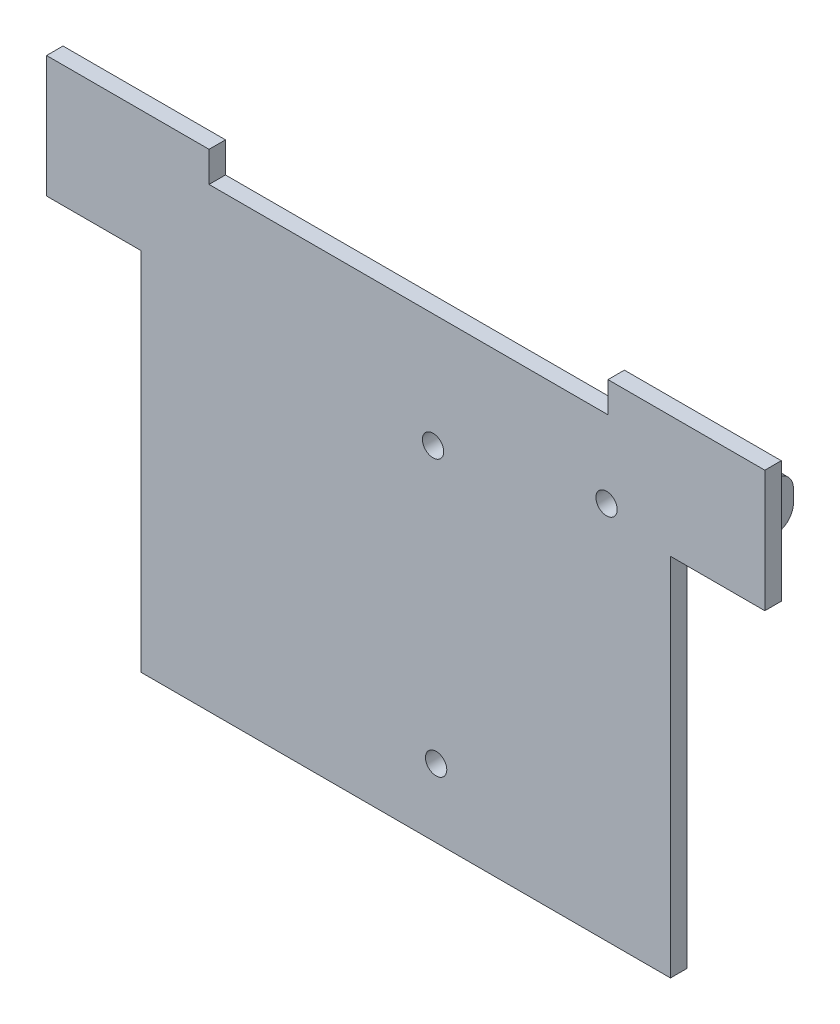
ISO-10303-21;
HEADER;
FILE_DESCRIPTION(('STEP AP214'),'2;1');
FILE_NAME('part.step','',(''),(''),'','','');
FILE_SCHEMA(('AUTOMOTIVE_DESIGN { 1 0 10303 214 1 1 1 1 }'));
ENDSEC;
DATA;
#1=APPLICATION_CONTEXT('core data for automotive mechanical design processes');
#2=APPLICATION_PROTOCOL_DEFINITION('international standard','automotive_design',2000,#1);
#3=PRODUCT_CONTEXT('',#1,'mechanical');
#4=PRODUCT('Part','Part','',(#3));
#5=PRODUCT_RELATED_PRODUCT_CATEGORY('part','',(#4));
#6=PRODUCT_DEFINITION_FORMATION('','',#4);
#7=PRODUCT_DEFINITION_CONTEXT('part definition',#1,'design');
#8=PRODUCT_DEFINITION('design','',#6,#7);
#9=PRODUCT_DEFINITION_SHAPE('','',#8);
#10=(LENGTH_UNIT() NAMED_UNIT(*) SI_UNIT(.MILLI.,.METRE.));
#11=(NAMED_UNIT(*) PLANE_ANGLE_UNIT() SI_UNIT($,.RADIAN.));
#12=(NAMED_UNIT(*) SI_UNIT($,.STERADIAN.) SOLID_ANGLE_UNIT());
#13=UNCERTAINTY_MEASURE_WITH_UNIT(LENGTH_MEASURE(1.E-05),#10,'distance_accuracy_value','');
#14=(GEOMETRIC_REPRESENTATION_CONTEXT(3) GLOBAL_UNCERTAINTY_ASSIGNED_CONTEXT((#13)) GLOBAL_UNIT_ASSIGNED_CONTEXT((#10,
#11,#12)) REPRESENTATION_CONTEXT('',''));
#15=CARTESIAN_POINT('',(0.,0.,0.));
#16=DIRECTION('',(0.,0.,1.));
#17=DIRECTION('',(1.,0.,0.));
#18=AXIS2_PLACEMENT_3D('',#15,#16,#17);
#19=CARTESIAN_POINT('',(-73.7662337662338,56.,2.7));
#20=DIRECTION('',(0.,-1.,0.));
#21=DIRECTION('',(0.,0.,-1.));
#22=AXIS2_PLACEMENT_3D('',#19,#20,#21);
#23=PLANE('',#22);
#24=DIRECTION('',(-1.,0.,0.));
#25=VECTOR('',#24,1.);
#26=CARTESIAN_POINT('',(-73.7662337662338,56.,2.7));
#27=LINE('',#26,#25);
#28=CARTESIAN_POINT('',(-47.0729665984484,56.,2.7));
#29=VERTEX_POINT('',#28);
#30=CARTESIAN_POINT('',(-73.7662337662338,56.,2.7));
#31=VERTEX_POINT('',#30);
#32=EDGE_CURVE('E359',#29,#31,#27,.T.);
#33=ORIENTED_EDGE('',*,*,#32,.F.);
#34=DIRECTION('',(0.,0.,1.));
#35=VECTOR('',#34,1.);
#36=CARTESIAN_POINT('',(-47.0729665984484,56.,-50.3));
#37=LINE('',#36,#35);
#38=CARTESIAN_POINT('',(-47.0729665984484,56.,0.));
#39=VERTEX_POINT('',#38);
#40=EDGE_CURVE('E250',#39,#29,#37,.T.);
#41=ORIENTED_EDGE('',*,*,#40,.F.);
#42=DIRECTION('',(-1.,0.,0.));
#43=VECTOR('',#42,1.);
#44=CARTESIAN_POINT('',(-73.7662337662338,56.,0.));
#45=LINE('',#44,#43);
#46=CARTESIAN_POINT('',(-73.7662337662338,56.,0.));
#47=VERTEX_POINT('',#46);
#48=EDGE_CURVE('E369',#39,#47,#45,.T.);
#49=ORIENTED_EDGE('',*,*,#48,.T.);
#50=DIRECTION('',(0.,0.,-1.));
#51=VECTOR('',#50,1.);
#52=CARTESIAN_POINT('',(-73.7662337662338,56.,2.7));
#53=LINE('',#52,#51);
#54=EDGE_CURVE('E361',#31,#47,#53,.T.);
#55=ORIENTED_EDGE('',*,*,#54,.F.);
#56=EDGE_LOOP('',(#33,#41,#49,#55));
#57=FACE_BOUND('',#56,.T.);
#58=ADVANCED_FACE('F36',(#57),#23,.F.);
#59=CARTESIAN_POINT('',(0.,0.,0.));
#60=DIRECTION('',(0.,0.,1.));
#61=DIRECTION('',(1.,0.,0.));
#62=AXIS2_PLACEMENT_3D('',#59,#60,#61);
#63=PLANE('',#62);
#64=CARTESIAN_POINT('',(-9.76623376633984,-12.7500000000244,0.));
#65=DIRECTION('',(0.,0.,-1.));
#66=DIRECTION('',(-1.,0.,0.));
#67=AXIS2_PLACEMENT_3D('',#64,#65,#66);
#68=CIRCLE('',#67,1.75);
#69=CARTESIAN_POINT('',(-11.5162337663398,-12.7500000000244,0.));
#70=VERTEX_POINT('',#69);
#71=EDGE_CURVE('E456',#70,#70,#68,.T.);
#72=ORIENTED_EDGE('',*,*,#71,.F.);
#73=EDGE_LOOP('',(#72));
#74=FACE_BOUND('',#73,.T.);
#75=CARTESIAN_POINT('',(-10.2662337663398,32.2499999999756,0.));
#76=DIRECTION('',(0.,0.,-1.));
#77=DIRECTION('',(-1.,0.,0.));
#78=AXIS2_PLACEMENT_3D('',#75,#76,#77);
#79=CIRCLE('',#78,1.75);
#80=CARTESIAN_POINT('',(-12.0162337663398,32.2499999999756,0.));
#81=VERTEX_POINT('',#80);
#82=EDGE_CURVE('E467',#81,#81,#79,.T.);
#83=ORIENTED_EDGE('',*,*,#82,.F.);
#84=EDGE_LOOP('',(#83));
#85=FACE_BOUND('',#84,.T.);
#86=CARTESIAN_POINT('',(18.2337662336602,38.2499999999756,0.));
#87=DIRECTION('',(0.,0.,-1.));
#88=DIRECTION('',(-1.,0.,0.));
#89=AXIS2_PLACEMENT_3D('',#86,#87,#88);
#90=CIRCLE('',#89,1.75);
#91=CARTESIAN_POINT('',(16.4837662336602,38.2499999999756,0.));
#92=VERTEX_POINT('',#91);
#93=EDGE_CURVE('E464',#92,#92,#90,.T.);
#94=ORIENTED_EDGE('',*,*,#93,.F.);
#95=EDGE_LOOP('',(#94));
#96=FACE_BOUND('',#95,.T.);
#97=ORIENTED_EDGE('',*,*,#48,.F.);
#98=DIRECTION('',(0.,-1.,0.));
#99=VECTOR('',#98,1.);
#100=CARTESIAN_POINT('',(-47.0729665984484,0.,0.));
#101=LINE('',#100,#99);
#102=CARTESIAN_POINT('',(-47.0729665984484,51.,0.));
#103=VERTEX_POINT('',#102);
#104=EDGE_CURVE('E256',#39,#103,#101,.T.);
#105=ORIENTED_EDGE('',*,*,#104,.T.);
#106=DIRECTION('',(1.,0.,0.));
#107=VECTOR('',#106,1.);
#108=CARTESIAN_POINT('',(0.,51.,0.));
#109=LINE('',#108,#107);
#110=CARTESIAN_POINT('',(18.4609188047904,51.,0.));
#111=VERTEX_POINT('',#110);
#112=EDGE_CURVE('E252',#103,#111,#109,.T.);
#113=ORIENTED_EDGE('',*,*,#112,.T.);
#114=DIRECTION('',(0.,1.,0.));
#115=VECTOR('',#114,1.);
#116=CARTESIAN_POINT('',(18.4609188047904,0.,0.));
#117=LINE('',#116,#115);
#118=CARTESIAN_POINT('',(18.4609188047904,56.,0.));
#119=VERTEX_POINT('',#118);
#120=EDGE_CURVE('E231',#111,#119,#117,.T.);
#121=ORIENTED_EDGE('',*,*,#120,.T.);
#122=CARTESIAN_POINT('',(44.2337662337662,56.,0.));
#123=VERTEX_POINT('',#122);
#124=EDGE_CURVE('E354',#123,#119,#45,.T.);
#125=ORIENTED_EDGE('',*,*,#124,.F.);
#126=DIRECTION('',(0.,1.,0.));
#127=VECTOR('',#126,1.);
#128=CARTESIAN_POINT('',(44.2337662337662,56.,0.));
#129=LINE('',#128,#127);
#130=CARTESIAN_POINT('',(44.2337662337662,36.,0.));
#131=VERTEX_POINT('',#130);
#132=EDGE_CURVE('E367',#131,#123,#129,.T.);
#133=ORIENTED_EDGE('',*,*,#132,.F.);
#134=DIRECTION('',(-1.,0.,0.));
#135=VECTOR('',#134,1.);
#136=CARTESIAN_POINT('',(44.2337662337662,36.,0.));
#137=LINE('',#136,#135);
#138=CARTESIAN_POINT('',(28.7337662337662,36.,0.));
#139=VERTEX_POINT('',#138);
#140=EDGE_CURVE('E347',#131,#139,#137,.T.);
#141=ORIENTED_EDGE('',*,*,#140,.T.);
#142=DIRECTION('',(0.,-1.,0.));
#143=VECTOR('',#142,1.);
#144=CARTESIAN_POINT('',(28.7337662337662,36.,0.));
#145=LINE('',#144,#143);
#146=CARTESIAN_POINT('',(28.7337662337662,-24.,0.));
#147=VERTEX_POINT('',#146);
#148=EDGE_CURVE('E330',#139,#147,#145,.T.);
#149=ORIENTED_EDGE('',*,*,#148,.T.);
#150=DIRECTION('',(1.,0.,0.));
#151=VECTOR('',#150,1.);
#152=CARTESIAN_POINT('',(-73.7662337662338,-24.,0.));
#153=LINE('',#152,#151);
#154=CARTESIAN_POINT('',(-58.2662337662337,-24.,0.));
#155=VERTEX_POINT('',#154);
#156=EDGE_CURVE('E364',#155,#147,#153,.T.);
#157=ORIENTED_EDGE('',*,*,#156,.F.);
#158=DIRECTION('',(0.,1.,0.));
#159=VECTOR('',#158,1.);
#160=CARTESIAN_POINT('',(-58.2662337662338,36.,0.));
#161=LINE('',#160,#159);
#162=CARTESIAN_POINT('',(-58.2662337662338,36.,0.));
#163=VERTEX_POINT('',#162);
#164=EDGE_CURVE('E314',#155,#163,#161,.T.);
#165=ORIENTED_EDGE('',*,*,#164,.T.);
#166=DIRECTION('',(-1.,0.,0.));
#167=VECTOR('',#166,1.);
#168=CARTESIAN_POINT('',(-73.7662337662338,36.,0.));
#169=LINE('',#168,#167);
#170=CARTESIAN_POINT('',(-73.7662337662338,36.,0.));
#171=VERTEX_POINT('',#170);
#172=EDGE_CURVE('E336',#163,#171,#169,.T.);
#173=ORIENTED_EDGE('',*,*,#172,.T.);
#174=DIRECTION('',(0.,-1.,0.));
#175=VECTOR('',#174,1.);
#176=CARTESIAN_POINT('',(-73.7662337662338,56.,0.));
#177=LINE('',#176,#175);
#178=EDGE_CURVE('E345',#47,#171,#177,.T.);
#179=ORIENTED_EDGE('',*,*,#178,.F.);
#180=EDGE_LOOP('',(#97,#105,#113,#121,#125,#133,#141,#149,#157,#165,#173,#179));
#181=FACE_BOUND('',#180,.T.);
#182=DIRECTION('',(0.,-1.,0.));
#183=VECTOR('',#182,1.);
#184=CARTESIAN_POINT('',(-63.7662337662338,40.,0.));
#185=LINE('',#184,#183);
#186=CARTESIAN_POINT('',(-63.7662337662338,51.,0.));
#187=VERTEX_POINT('',#186);
#188=CARTESIAN_POINT('',(-63.7662337662338,37.,0.));
#189=VERTEX_POINT('',#188);
#190=EDGE_CURVE('E296',#187,#189,#185,.T.);
#191=ORIENTED_EDGE('',*,*,#190,.F.);
#192=DIRECTION('',(1.,0.,0.));
#193=VECTOR('',#192,1.);
#194=CARTESIAN_POINT('',(-67.7662337662338,51.,0.));
#195=LINE('',#194,#193);
#196=CARTESIAN_POINT('',(-67.7662337662338,51.,0.));
#197=VERTEX_POINT('',#196);
#198=EDGE_CURVE('E387',#187,#197,#195,.F.);
#199=ORIENTED_EDGE('',*,*,#198,.T.);
#200=DIRECTION('',(0.,1.,0.));
#201=VECTOR('',#200,1.);
#202=CARTESIAN_POINT('',(-67.7662337662338,40.,0.));
#203=LINE('',#202,#201);
#204=CARTESIAN_POINT('',(-67.7662337662338,37.,0.));
#205=VERTEX_POINT('',#204);
#206=EDGE_CURVE('E287',#205,#197,#203,.T.);
#207=ORIENTED_EDGE('',*,*,#206,.F.);
#208=DIRECTION('',(-1.,0.,0.));
#209=VECTOR('',#208,1.);
#210=CARTESIAN_POINT('',(-63.7662337662338,37.,0.));
#211=LINE('',#210,#209);
#212=EDGE_CURVE('E384',#205,#189,#211,.F.);
#213=ORIENTED_EDGE('',*,*,#212,.T.);
#214=EDGE_LOOP('',(#191,#199,#207,#213));
#215=FACE_BOUND('',#214,.T.);
#216=DIRECTION('',(0.,-1.,0.));
#217=VECTOR('',#216,1.);
#218=CARTESIAN_POINT('',(38.2337662337662,40.,0.));
#219=LINE('',#218,#217);
#220=CARTESIAN_POINT('',(38.2337662337662,51.,0.));
#221=VERTEX_POINT('',#220);
#222=CARTESIAN_POINT('',(38.2337662337662,37.,0.));
#223=VERTEX_POINT('',#222);
#224=EDGE_CURVE('E284',#221,#223,#219,.T.);
#225=ORIENTED_EDGE('',*,*,#224,.F.);
#226=DIRECTION('',(1.,0.,0.));
#227=VECTOR('',#226,1.);
#228=CARTESIAN_POINT('',(34.2337662337662,51.,0.));
#229=LINE('',#228,#227);
#230=CARTESIAN_POINT('',(34.2337662337662,51.,0.));
#231=VERTEX_POINT('',#230);
#232=EDGE_CURVE('E393',#221,#231,#229,.F.);
#233=ORIENTED_EDGE('',*,*,#232,.T.);
#234=DIRECTION('',(0.,1.,0.));
#235=VECTOR('',#234,1.);
#236=CARTESIAN_POINT('',(34.2337662337662,40.,0.));
#237=LINE('',#236,#235);
#238=CARTESIAN_POINT('',(34.2337662337662,37.,0.));
#239=VERTEX_POINT('',#238);
#240=EDGE_CURVE('E282',#239,#231,#237,.T.);
#241=ORIENTED_EDGE('',*,*,#240,.F.);
#242=DIRECTION('',(-1.,0.,0.));
#243=VECTOR('',#242,1.);
#244=CARTESIAN_POINT('',(38.2337662337662,37.,0.));
#245=LINE('',#244,#243);
#246=EDGE_CURVE('E390',#239,#223,#245,.F.);
#247=ORIENTED_EDGE('',*,*,#246,.T.);
#248=EDGE_LOOP('',(#225,#233,#241,#247));
#249=FACE_BOUND('',#248,.T.);
#250=ADVANCED_FACE('F475',(#74,#85,#96,#181,#215,#249),#63,.F.);
#251=CARTESIAN_POINT('',(-73.7662337662338,56.,2.7));
#252=DIRECTION('',(1.,0.,0.));
#253=DIRECTION('',(0.,1.,0.));
#254=AXIS2_PLACEMENT_3D('',#251,#252,#253);
#255=PLANE('',#254);
#256=ORIENTED_EDGE('',*,*,#178,.T.);
#257=DIRECTION('',(0.,0.,1.));
#258=VECTOR('',#257,1.);
#259=CARTESIAN_POINT('',(-73.7662337662338,36.,0.));
#260=LINE('',#259,#258);
#261=CARTESIAN_POINT('',(-73.7662337662338,36.,2.7));
#262=VERTEX_POINT('',#261);
#263=EDGE_CURVE('E339',#171,#262,#260,.T.);
#264=ORIENTED_EDGE('',*,*,#263,.T.);
#265=DIRECTION('',(0.,-1.,0.));
#266=VECTOR('',#265,1.);
#267=CARTESIAN_POINT('',(-73.7662337662338,56.,2.7));
#268=LINE('',#267,#266);
#269=EDGE_CURVE('E350',#31,#262,#268,.T.);
#270=ORIENTED_EDGE('',*,*,#269,.F.);
#271=ORIENTED_EDGE('',*,*,#54,.T.);
#272=EDGE_LOOP('',(#256,#264,#270,#271));
#273=FACE_BOUND('',#272,.T.);
#274=ADVANCED_FACE('F478',(#273),#255,.F.);
#275=CARTESIAN_POINT('',(-73.7662337662338,-24.,2.7));
#276=DIRECTION('',(0.,1.,0.));
#277=DIRECTION('',(0.,0.,1.));
#278=AXIS2_PLACEMENT_3D('',#275,#276,#277);
#279=PLANE('',#278);
#280=DIRECTION('',(1.,0.,0.));
#281=VECTOR('',#280,1.);
#282=CARTESIAN_POINT('',(-73.7662337662338,-24.,2.7));
#283=LINE('',#282,#281);
#284=CARTESIAN_POINT('',(-58.2662337662337,-24.,2.7));
#285=VERTEX_POINT('',#284);
#286=CARTESIAN_POINT('',(28.7337662337662,-24.,2.7));
#287=VERTEX_POINT('',#286);
#288=EDGE_CURVE('E353',#285,#287,#283,.T.);
#289=ORIENTED_EDGE('',*,*,#288,.F.);
#290=DIRECTION('',(0.,0.,1.));
#291=VECTOR('',#290,1.);
#292=CARTESIAN_POINT('',(-58.2662337662337,-24.,0.));
#293=LINE('',#292,#291);
#294=EDGE_CURVE('E317',#155,#285,#293,.T.);
#295=ORIENTED_EDGE('',*,*,#294,.F.);
#296=ORIENTED_EDGE('',*,*,#156,.T.);
#297=DIRECTION('',(0.,0.,1.));
#298=VECTOR('',#297,1.);
#299=CARTESIAN_POINT('',(28.7337662337662,-24.,0.));
#300=LINE('',#299,#298);
#301=EDGE_CURVE('E313',#147,#287,#300,.T.);
#302=ORIENTED_EDGE('',*,*,#301,.T.);
#303=EDGE_LOOP('',(#289,#295,#296,#302));
#304=FACE_BOUND('',#303,.T.);
#305=ADVANCED_FACE('F553',(#304),#279,.F.);
#306=CARTESIAN_POINT('',(44.2337662337662,56.,2.7));
#307=DIRECTION('',(-1.,0.,0.));
#308=DIRECTION('',(0.,-1.,0.));
#309=AXIS2_PLACEMENT_3D('',#306,#307,#308);
#310=PLANE('',#309);
#311=DIRECTION('',(0.,1.,0.));
#312=VECTOR('',#311,1.);
#313=CARTESIAN_POINT('',(44.2337662337662,56.,2.7));
#314=LINE('',#313,#312);
#315=CARTESIAN_POINT('',(44.2337662337662,36.,2.7));
#316=VERTEX_POINT('',#315);
#317=CARTESIAN_POINT('',(44.2337662337662,56.,2.7));
#318=VERTEX_POINT('',#317);
#319=EDGE_CURVE('E357',#316,#318,#314,.T.);
#320=ORIENTED_EDGE('',*,*,#319,.F.);
#321=DIRECTION('',(0.,0.,1.));
#322=VECTOR('',#321,1.);
#323=CARTESIAN_POINT('',(44.2337662337662,36.,0.));
#324=LINE('',#323,#322);
#325=EDGE_CURVE('E325',#131,#316,#324,.T.);
#326=ORIENTED_EDGE('',*,*,#325,.F.);
#327=ORIENTED_EDGE('',*,*,#132,.T.);
#328=DIRECTION('',(0.,0.,-1.));
#329=VECTOR('',#328,1.);
#330=CARTESIAN_POINT('',(44.2337662337662,56.,2.7));
#331=LINE('',#330,#329);
#332=EDGE_CURVE('E374',#318,#123,#331,.T.);
#333=ORIENTED_EDGE('',*,*,#332,.F.);
#334=EDGE_LOOP('',(#320,#326,#327,#333));
#335=FACE_BOUND('',#334,.T.);
#336=ADVANCED_FACE('F544',(#335),#310,.F.);
#337=ORIENTED_EDGE('',*,*,#124,.T.);
#338=DIRECTION('',(0.,0.,1.));
#339=VECTOR('',#338,1.);
#340=CARTESIAN_POINT('',(18.4609188047904,56.,-50.3));
#341=LINE('',#340,#339);
#342=CARTESIAN_POINT('',(18.4609188047904,56.,2.7));
#343=VERTEX_POINT('',#342);
#344=EDGE_CURVE('E234',#119,#343,#341,.T.);
#345=ORIENTED_EDGE('',*,*,#344,.T.);
#346=EDGE_CURVE('E245',#318,#343,#27,.T.);
#347=ORIENTED_EDGE('',*,*,#346,.F.);
#348=ORIENTED_EDGE('',*,*,#332,.T.);
#349=EDGE_LOOP('',(#337,#345,#347,#348));
#350=FACE_BOUND('',#349,.T.);
#351=ADVANCED_FACE('F538',(#350),#23,.F.);
#352=CARTESIAN_POINT('',(0.,0.,2.7));
#353=DIRECTION('',(0.,0.,1.));
#354=DIRECTION('',(1.,0.,0.));
#355=AXIS2_PLACEMENT_3D('',#352,#353,#354);
#356=PLANE('',#355);
#357=CARTESIAN_POINT('',(-9.76623376633984,-12.7500000000244,2.7));
#358=DIRECTION('',(0.,0.,1.));
#359=DIRECTION('',(1.,0.,0.));
#360=AXIS2_PLACEMENT_3D('',#357,#358,#359);
#361=CIRCLE('',#360,1.75);
#362=CARTESIAN_POINT('',(-8.01623376633984,-12.7500000000244,2.7));
#363=VERTEX_POINT('',#362);
#364=EDGE_CURVE('E40',#363,#363,#361,.T.);
#365=ORIENTED_EDGE('',*,*,#364,.F.);
#366=EDGE_LOOP('',(#365));
#367=FACE_BOUND('',#366,.T.);
#368=CARTESIAN_POINT('',(-10.2662337663398,32.2499999999756,2.7));
#369=DIRECTION('',(0.,0.,1.));
#370=DIRECTION('',(1.,0.,0.));
#371=AXIS2_PLACEMENT_3D('',#368,#369,#370);
#372=CIRCLE('',#371,1.75);
#373=CARTESIAN_POINT('',(-8.51623376633984,32.2499999999756,2.7));
#374=VERTEX_POINT('',#373);
#375=EDGE_CURVE('E455',#374,#374,#372,.T.);
#376=ORIENTED_EDGE('',*,*,#375,.F.);
#377=EDGE_LOOP('',(#376));
#378=FACE_BOUND('',#377,.T.);
#379=CARTESIAN_POINT('',(18.2337662336602,38.2499999999756,2.7));
#380=DIRECTION('',(0.,0.,1.));
#381=DIRECTION('',(1.,0.,0.));
#382=AXIS2_PLACEMENT_3D('',#379,#380,#381);
#383=CIRCLE('',#382,1.75);
#384=CARTESIAN_POINT('',(19.9837662336602,38.2499999999756,2.7));
#385=VERTEX_POINT('',#384);
#386=EDGE_CURVE('E453',#385,#385,#383,.T.);
#387=ORIENTED_EDGE('',*,*,#386,.F.);
#388=EDGE_LOOP('',(#387));
#389=FACE_BOUND('',#388,.T.);
#390=DIRECTION('',(0.,-1.,0.));
#391=VECTOR('',#390,1.);
#392=CARTESIAN_POINT('',(-47.0729665984484,56.,2.7));
#393=LINE('',#392,#391);
#394=CARTESIAN_POINT('',(-47.0729665984484,51.,2.7));
#395=VERTEX_POINT('',#394);
#396=EDGE_CURVE('E53',#29,#395,#393,.T.);
#397=ORIENTED_EDGE('',*,*,#396,.F.);
#398=ORIENTED_EDGE('',*,*,#32,.T.);
#399=ORIENTED_EDGE('',*,*,#269,.T.);
#400=DIRECTION('',(-1.,0.,0.));
#401=VECTOR('',#400,1.);
#402=CARTESIAN_POINT('',(-73.7662337662338,36.,2.7));
#403=LINE('',#402,#401);
#404=CARTESIAN_POINT('',(-58.2662337662338,36.,2.7));
#405=VERTEX_POINT('',#404);
#406=EDGE_CURVE('E340',#405,#262,#403,.T.);
#407=ORIENTED_EDGE('',*,*,#406,.F.);
#408=DIRECTION('',(0.,1.,0.));
#409=VECTOR('',#408,1.);
#410=CARTESIAN_POINT('',(-58.2662337662338,36.,2.7));
#411=LINE('',#410,#409);
#412=EDGE_CURVE('E318',#285,#405,#411,.T.);
#413=ORIENTED_EDGE('',*,*,#412,.F.);
#414=ORIENTED_EDGE('',*,*,#288,.T.);
#415=DIRECTION('',(0.,-1.,0.));
#416=VECTOR('',#415,1.);
#417=CARTESIAN_POINT('',(28.7337662337662,36.,2.7));
#418=LINE('',#417,#416);
#419=CARTESIAN_POINT('',(28.7337662337662,36.,2.7));
#420=VERTEX_POINT('',#419);
#421=EDGE_CURVE('E321',#420,#287,#418,.T.);
#422=ORIENTED_EDGE('',*,*,#421,.F.);
#423=DIRECTION('',(-1.,0.,0.));
#424=VECTOR('',#423,1.);
#425=CARTESIAN_POINT('',(44.2337662337662,36.,2.7));
#426=LINE('',#425,#424);
#427=EDGE_CURVE('E342',#316,#420,#426,.T.);
#428=ORIENTED_EDGE('',*,*,#427,.F.);
#429=ORIENTED_EDGE('',*,*,#319,.T.);
#430=ORIENTED_EDGE('',*,*,#346,.T.);
#431=DIRECTION('',(0.,1.,0.));
#432=VECTOR('',#431,1.);
#433=CARTESIAN_POINT('',(18.4609188047904,56.,2.7));
#434=LINE('',#433,#432);
#435=CARTESIAN_POINT('',(18.4609188047904,51.,2.7));
#436=VERTEX_POINT('',#435);
#437=EDGE_CURVE('E228',#436,#343,#434,.T.);
#438=ORIENTED_EDGE('',*,*,#437,.F.);
#439=DIRECTION('',(1.,0.,0.));
#440=VECTOR('',#439,1.);
#441=CARTESIAN_POINT('',(-47.0729665984484,51.,2.7));
#442=LINE('',#441,#440);
#443=EDGE_CURVE('E238',#395,#436,#442,.T.);
#444=ORIENTED_EDGE('',*,*,#443,.F.);
#445=EDGE_LOOP('',(#397,#398,#399,#407,#413,#414,#422,#428,#429,#430,#438,#444));
#446=FACE_BOUND('',#445,.T.);
#447=ADVANCED_FACE('F243',(#367,#378,#389,#446),#356,.T.);
#448=CARTESIAN_POINT('',(44.2337662337662,36.,0.));
#449=DIRECTION('',(0.,1.,0.));
#450=DIRECTION('',(0.,0.,1.));
#451=AXIS2_PLACEMENT_3D('',#448,#449,#450);
#452=PLANE('',#451);
#453=ORIENTED_EDGE('',*,*,#427,.T.);
#454=DIRECTION('',(0.,0.,1.));
#455=VECTOR('',#454,1.);
#456=CARTESIAN_POINT('',(28.7337662337662,36.,0.));
#457=LINE('',#456,#455);
#458=EDGE_CURVE('E327',#139,#420,#457,.T.);
#459=ORIENTED_EDGE('',*,*,#458,.F.);
#460=ORIENTED_EDGE('',*,*,#140,.F.);
#461=ORIENTED_EDGE('',*,*,#325,.T.);
#462=EDGE_LOOP('',(#453,#459,#460,#461));
#463=FACE_BOUND('',#462,.T.);
#464=ADVANCED_FACE('F550',(#463),#452,.F.);
#465=CARTESIAN_POINT('',(-73.7662337662338,36.,0.));
#466=DIRECTION('',(0.,1.,0.));
#467=DIRECTION('',(0.,0.,1.));
#468=AXIS2_PLACEMENT_3D('',#465,#466,#467);
#469=PLANE('',#468);
#470=ORIENTED_EDGE('',*,*,#406,.T.);
#471=ORIENTED_EDGE('',*,*,#263,.F.);
#472=ORIENTED_EDGE('',*,*,#172,.F.);
#473=DIRECTION('',(0.,0.,1.));
#474=VECTOR('',#473,1.);
#475=CARTESIAN_POINT('',(-58.2662337662338,36.,0.));
#476=LINE('',#475,#474);
#477=EDGE_CURVE('E322',#163,#405,#476,.T.);
#478=ORIENTED_EDGE('',*,*,#477,.T.);
#479=EDGE_LOOP('',(#470,#471,#472,#478));
#480=FACE_BOUND('',#479,.T.);
#481=ADVANCED_FACE('F565',(#480),#469,.F.);
#482=CARTESIAN_POINT('',(-58.2662337662338,36.,0.));
#483=DIRECTION('',(1.,0.,0.));
#484=DIRECTION('',(0.,1.,0.));
#485=AXIS2_PLACEMENT_3D('',#482,#483,#484);
#486=PLANE('',#485);
#487=ORIENTED_EDGE('',*,*,#412,.T.);
#488=ORIENTED_EDGE('',*,*,#477,.F.);
#489=ORIENTED_EDGE('',*,*,#164,.F.);
#490=ORIENTED_EDGE('',*,*,#294,.T.);
#491=EDGE_LOOP('',(#487,#488,#489,#490));
#492=FACE_BOUND('',#491,.T.);
#493=ADVANCED_FACE('F570',(#492),#486,.F.);
#494=CARTESIAN_POINT('',(28.7337662337662,36.,0.));
#495=DIRECTION('',(-1.,0.,0.));
#496=DIRECTION('',(0.,0.,1.));
#497=AXIS2_PLACEMENT_3D('',#494,#495,#496);
#498=PLANE('',#497);
#499=ORIENTED_EDGE('',*,*,#421,.T.);
#500=ORIENTED_EDGE('',*,*,#301,.F.);
#501=ORIENTED_EDGE('',*,*,#148,.F.);
#502=ORIENTED_EDGE('',*,*,#458,.T.);
#503=EDGE_LOOP('',(#499,#500,#501,#502));
#504=FACE_BOUND('',#503,.T.);
#505=ADVANCED_FACE('F577',(#504),#498,.F.);
#506=CARTESIAN_POINT('',(-67.7662337662338,40.,-8.));
#507=DIRECTION('',(1.,0.,0.));
#508=DIRECTION('',(0.,0.,-1.));
#509=AXIS2_PLACEMENT_3D('',#506,#507,#508);
#510=PLANE('',#509);
#511=CARTESIAN_POINT('',(-67.7662337662338,44.,-4.));
#512=DIRECTION('',(1.,0.,0.));
#513=DIRECTION('',(0.,0.,-1.));
#514=AXIS2_PLACEMENT_3D('',#511,#512,#513);
#515=CIRCLE('',#514,1.75);
#516=CARTESIAN_POINT('',(-67.7662337662338,44.,-5.75));
#517=VERTEX_POINT('',#516);
#518=EDGE_CURVE('E266',#517,#517,#515,.T.);
#519=ORIENTED_EDGE('',*,*,#518,.T.);
#520=EDGE_LOOP('',(#519));
#521=FACE_BOUND('',#520,.T.);
#522=DIRECTION('',(0.,1.,0.));
#523=VECTOR('',#522,1.);
#524=CARTESIAN_POINT('',(-67.7662337662338,40.,-8.));
#525=LINE('',#524,#523);
#526=CARTESIAN_POINT('',(-67.7662337662338,43.,-8.));
#527=VERTEX_POINT('',#526);
#528=CARTESIAN_POINT('',(-67.7662337662338,45.,-8.));
#529=VERTEX_POINT('',#528);
#530=EDGE_CURVE('E292',#527,#529,#525,.T.);
#531=ORIENTED_EDGE('',*,*,#530,.F.);
#532=CARTESIAN_POINT('',(-67.7662337662338,43.,-5.));
#533=DIRECTION('',(1.,0.,0.));
#534=DIRECTION('',(0.,0.,-1.));
#535=AXIS2_PLACEMENT_3D('',#532,#533,#534);
#536=CIRCLE('',#535,3.);
#537=CARTESIAN_POINT('',(-67.7662337662338,40.,-5.));
#538=VERTEX_POINT('',#537);
#539=EDGE_CURVE('E423',#527,#538,#536,.F.);
#540=ORIENTED_EDGE('',*,*,#539,.T.);
#541=DIRECTION('',(0.,0.,1.));
#542=VECTOR('',#541,1.);
#543=CARTESIAN_POINT('',(-67.7662337662338,40.,-8.));
#544=LINE('',#543,#542);
#545=CARTESIAN_POINT('',(-67.7662337662338,40.,-3.));
#546=VERTEX_POINT('',#545);
#547=EDGE_CURVE('E299',#538,#546,#544,.T.);
#548=ORIENTED_EDGE('',*,*,#547,.T.);
#549=CARTESIAN_POINT('',(-67.7662337662338,37.,-3.));
#550=DIRECTION('',(1.,0.,0.));
#551=DIRECTION('',(0.,0.,-1.));
#552=AXIS2_PLACEMENT_3D('',#549,#550,#551);
#553=CIRCLE('',#552,3.);
#554=EDGE_CURVE('E45',#546,#205,#553,.T.);
#555=ORIENTED_EDGE('',*,*,#554,.T.);
#556=ORIENTED_EDGE('',*,*,#206,.T.);
#557=CARTESIAN_POINT('',(-67.7662337662338,51.,-3.));
#558=DIRECTION('',(1.,0.,0.));
#559=DIRECTION('',(0.,0.,-1.));
#560=AXIS2_PLACEMENT_3D('',#557,#558,#559);
#561=CIRCLE('',#560,3.);
#562=CARTESIAN_POINT('',(-67.7662337662338,48.,-3.));
#563=VERTEX_POINT('',#562);
#564=EDGE_CURVE('E449',#197,#563,#561,.T.);
#565=ORIENTED_EDGE('',*,*,#564,.T.);
#566=DIRECTION('',(0.,0.,1.));
#567=VECTOR('',#566,1.);
#568=CARTESIAN_POINT('',(-67.7662337662338,48.,-8.));
#569=LINE('',#568,#567);
#570=CARTESIAN_POINT('',(-67.7662337662338,48.,-5.));
#571=VERTEX_POINT('',#570);
#572=EDGE_CURVE('E310',#571,#563,#569,.T.);
#573=ORIENTED_EDGE('',*,*,#572,.F.);
#574=CARTESIAN_POINT('',(-67.7662337662338,45.,-5.));
#575=DIRECTION('',(1.,0.,0.));
#576=DIRECTION('',(0.,0.,-1.));
#577=AXIS2_PLACEMENT_3D('',#574,#575,#576);
#578=CIRCLE('',#577,3.);
#579=EDGE_CURVE('E421',#571,#529,#578,.F.);
#580=ORIENTED_EDGE('',*,*,#579,.T.);
#581=EDGE_LOOP('',(#531,#540,#548,#555,#556,#565,#573,#580));
#582=FACE_BOUND('',#581,.T.);
#583=ADVANCED_FACE('F591',(#521,#582),#510,.F.);
#584=CARTESIAN_POINT('',(-67.7662337662338,48.,-8.));
#585=DIRECTION('',(0.,-1.,0.));
#586=DIRECTION('',(1.,0.,0.));
#587=AXIS2_PLACEMENT_3D('',#584,#585,#586);
#588=PLANE('',#587);
#589=DIRECTION('',(0.,0.,1.));
#590=VECTOR('',#589,1.);
#591=CARTESIAN_POINT('',(-63.7662337662338,48.,-8.));
#592=LINE('',#591,#590);
#593=CARTESIAN_POINT('',(-63.7662337662338,48.,-5.));
#594=VERTEX_POINT('',#593);
#595=CARTESIAN_POINT('',(-63.7662337662338,48.,-3.));
#596=VERTEX_POINT('',#595);
#597=EDGE_CURVE('E307',#594,#596,#592,.T.);
#598=ORIENTED_EDGE('',*,*,#597,.F.);
#599=DIRECTION('',(1.,0.,0.));
#600=VECTOR('',#599,1.);
#601=CARTESIAN_POINT('',(-67.7662337662338,48.,-5.));
#602=LINE('',#601,#600);
#603=EDGE_CURVE('E436',#594,#571,#602,.F.);
#604=ORIENTED_EDGE('',*,*,#603,.T.);
#605=ORIENTED_EDGE('',*,*,#572,.T.);
#606=DIRECTION('',(1.,0.,0.));
#607=VECTOR('',#606,1.);
#608=CARTESIAN_POINT('',(-63.7662337662338,48.,-3.));
#609=LINE('',#608,#607);
#610=EDGE_CURVE('E434',#563,#596,#609,.T.);
#611=ORIENTED_EDGE('',*,*,#610,.T.);
#612=EDGE_LOOP('',(#598,#604,#605,#611));
#613=FACE_BOUND('',#612,.T.);
#614=ADVANCED_FACE('F596',(#613),#588,.F.);
#615=CARTESIAN_POINT('',(-63.7662337662338,40.,-8.));
#616=DIRECTION('',(-1.,0.,0.));
#617=DIRECTION('',(0.,0.,1.));
#618=AXIS2_PLACEMENT_3D('',#615,#616,#617);
#619=PLANE('',#618);
#620=CARTESIAN_POINT('',(-63.7662337662338,44.,-4.));
#621=DIRECTION('',(-1.,0.,0.));
#622=DIRECTION('',(0.,0.,1.));
#623=AXIS2_PLACEMENT_3D('',#620,#621,#622);
#624=CIRCLE('',#623,1.75);
#625=CARTESIAN_POINT('',(-63.7662337662338,44.,-2.25));
#626=VERTEX_POINT('',#625);
#627=EDGE_CURVE('E263',#626,#626,#624,.T.);
#628=ORIENTED_EDGE('',*,*,#627,.T.);
#629=EDGE_LOOP('',(#628));
#630=FACE_BOUND('',#629,.T.);
#631=DIRECTION('',(0.,0.,1.));
#632=VECTOR('',#631,1.);
#633=CARTESIAN_POINT('',(-63.7662337662338,40.,-8.));
#634=LINE('',#633,#632);
#635=CARTESIAN_POINT('',(-63.7662337662338,40.,-5.));
#636=VERTEX_POINT('',#635);
#637=CARTESIAN_POINT('',(-63.7662337662338,40.,-3.));
#638=VERTEX_POINT('',#637);
#639=EDGE_CURVE('E304',#636,#638,#634,.T.);
#640=ORIENTED_EDGE('',*,*,#639,.F.);
#641=CARTESIAN_POINT('',(-63.7662337662338,43.,-5.));
#642=DIRECTION('',(-1.,0.,0.));
#643=DIRECTION('',(0.,0.,1.));
#644=AXIS2_PLACEMENT_3D('',#641,#642,#643);
#645=CIRCLE('',#644,3.);
#646=CARTESIAN_POINT('',(-63.7662337662338,43.,-8.));
#647=VERTEX_POINT('',#646);
#648=EDGE_CURVE('E432',#636,#647,#645,.F.);
#649=ORIENTED_EDGE('',*,*,#648,.T.);
#650=DIRECTION('',(0.,-1.,0.));
#651=VECTOR('',#650,1.);
#652=CARTESIAN_POINT('',(-63.7662337662338,40.,-8.));
#653=LINE('',#652,#651);
#654=CARTESIAN_POINT('',(-63.7662337662338,45.,-8.));
#655=VERTEX_POINT('',#654);
#656=EDGE_CURVE('E295',#655,#647,#653,.T.);
#657=ORIENTED_EDGE('',*,*,#656,.F.);
#658=CARTESIAN_POINT('',(-63.7662337662338,45.,-5.));
#659=DIRECTION('',(-1.,0.,0.));
#660=DIRECTION('',(0.,0.,1.));
#661=AXIS2_PLACEMENT_3D('',#658,#659,#660);
#662=CIRCLE('',#661,3.);
#663=EDGE_CURVE('E430',#655,#594,#662,.F.);
#664=ORIENTED_EDGE('',*,*,#663,.T.);
#665=ORIENTED_EDGE('',*,*,#597,.T.);
#666=CARTESIAN_POINT('',(-63.7662337662338,51.,-3.));
#667=DIRECTION('',(-1.,0.,0.));
#668=DIRECTION('',(0.,0.,1.));
#669=AXIS2_PLACEMENT_3D('',#666,#667,#668);
#670=CIRCLE('',#669,3.);
#671=EDGE_CURVE('E61',#596,#187,#670,.T.);
#672=ORIENTED_EDGE('',*,*,#671,.T.);
#673=ORIENTED_EDGE('',*,*,#190,.T.);
#674=CARTESIAN_POINT('',(-63.7662337662338,37.,-3.));
#675=DIRECTION('',(-1.,0.,0.));
#676=DIRECTION('',(0.,0.,1.));
#677=AXIS2_PLACEMENT_3D('',#674,#675,#676);
#678=CIRCLE('',#677,3.);
#679=EDGE_CURVE('E11',#189,#638,#678,.T.);
#680=ORIENTED_EDGE('',*,*,#679,.T.);
#681=EDGE_LOOP('',(#640,#649,#657,#664,#665,#672,#673,#680));
#682=FACE_BOUND('',#681,.T.);
#683=ADVANCED_FACE('F600',(#630,#682),#619,.F.);
#684=CARTESIAN_POINT('',(-67.7662337662338,40.,-8.));
#685=DIRECTION('',(0.,1.,0.));
#686=DIRECTION('',(0.,0.,1.));
#687=AXIS2_PLACEMENT_3D('',#684,#685,#686);
#688=PLANE('',#687);
#689=ORIENTED_EDGE('',*,*,#547,.F.);
#690=DIRECTION('',(-1.,0.,0.));
#691=VECTOR('',#690,1.);
#692=CARTESIAN_POINT('',(-63.7662337662338,40.,-5.));
#693=LINE('',#692,#691);
#694=EDGE_CURVE('E428',#538,#636,#693,.F.);
#695=ORIENTED_EDGE('',*,*,#694,.T.);
#696=ORIENTED_EDGE('',*,*,#639,.T.);
#697=DIRECTION('',(-1.,0.,0.));
#698=VECTOR('',#697,1.);
#699=CARTESIAN_POINT('',(-67.7662337662338,40.,-3.));
#700=LINE('',#699,#698);
#701=EDGE_CURVE('E425',#638,#546,#700,.T.);
#702=ORIENTED_EDGE('',*,*,#701,.T.);
#703=EDGE_LOOP('',(#689,#695,#696,#702));
#704=FACE_BOUND('',#703,.T.);
#705=ADVANCED_FACE('F604',(#704),#688,.F.);
#706=CARTESIAN_POINT('',(0.,0.,-8.));
#707=DIRECTION('',(0.,0.,-1.));
#708=DIRECTION('',(-1.,0.,0.));
#709=AXIS2_PLACEMENT_3D('',#706,#707,#708);
#710=PLANE('',#709);
#711=ORIENTED_EDGE('',*,*,#656,.T.);
#712=DIRECTION('',(-1.,0.,0.));
#713=VECTOR('',#712,1.);
#714=CARTESIAN_POINT('',(-67.7662337662338,43.,-8.));
#715=LINE('',#714,#713);
#716=EDGE_CURVE('E418',#647,#527,#715,.T.);
#717=ORIENTED_EDGE('',*,*,#716,.T.);
#718=ORIENTED_EDGE('',*,*,#530,.T.);
#719=DIRECTION('',(1.,0.,0.));
#720=VECTOR('',#719,1.);
#721=CARTESIAN_POINT('',(-63.7662337662338,45.,-8.));
#722=LINE('',#721,#720);
#723=EDGE_CURVE('E415',#529,#655,#722,.T.);
#724=ORIENTED_EDGE('',*,*,#723,.T.);
#725=EDGE_LOOP('',(#711,#717,#718,#724));
#726=FACE_BOUND('',#725,.T.);
#727=ADVANCED_FACE('F608',(#726),#710,.T.);
#728=CARTESIAN_POINT('',(38.2337662337662,40.,-8.));
#729=DIRECTION('',(-1.,0.,0.));
#730=DIRECTION('',(0.,0.,1.));
#731=AXIS2_PLACEMENT_3D('',#728,#729,#730);
#732=PLANE('',#731);
#733=CARTESIAN_POINT('',(38.2337662337662,44.,-4.));
#734=DIRECTION('',(1.,0.,0.));
#735=DIRECTION('',(0.,0.,-1.));
#736=AXIS2_PLACEMENT_3D('',#733,#734,#735);
#737=CIRCLE('',#736,1.75);
#738=CARTESIAN_POINT('',(38.2337662337662,44.,-5.75));
#739=VERTEX_POINT('',#738);
#740=EDGE_CURVE('E259',#739,#739,#737,.T.);
#741=ORIENTED_EDGE('',*,*,#740,.F.);
#742=EDGE_LOOP('',(#741));
#743=FACE_BOUND('',#742,.T.);
#744=DIRECTION('',(0.,-1.,0.));
#745=VECTOR('',#744,1.);
#746=CARTESIAN_POINT('',(38.2337662337662,40.,-8.));
#747=LINE('',#746,#745);
#748=CARTESIAN_POINT('',(38.2337662337662,45.,-8.));
#749=VERTEX_POINT('',#748);
#750=CARTESIAN_POINT('',(38.2337662337662,43.,-8.));
#751=VERTEX_POINT('',#750);
#752=EDGE_CURVE('E285',#749,#751,#747,.T.);
#753=ORIENTED_EDGE('',*,*,#752,.F.);
#754=CARTESIAN_POINT('',(38.2337662337662,45.,-5.));
#755=DIRECTION('',(-1.,0.,0.));
#756=DIRECTION('',(0.,0.,1.));
#757=AXIS2_PLACEMENT_3D('',#754,#755,#756);
#758=CIRCLE('',#757,3.);
#759=CARTESIAN_POINT('',(38.2337662337662,48.,-5.));
#760=VERTEX_POINT('',#759);
#761=EDGE_CURVE('E404',#749,#760,#758,.F.);
#762=ORIENTED_EDGE('',*,*,#761,.T.);
#763=DIRECTION('',(0.,0.,1.));
#764=VECTOR('',#763,1.);
#765=CARTESIAN_POINT('',(38.2337662337662,48.,-8.));
#766=LINE('',#765,#764);
#767=CARTESIAN_POINT('',(38.2337662337662,48.,-3.));
#768=VERTEX_POINT('',#767);
#769=EDGE_CURVE('E278',#760,#768,#766,.T.);
#770=ORIENTED_EDGE('',*,*,#769,.T.);
#771=CARTESIAN_POINT('',(38.2337662337662,51.,-3.));
#772=DIRECTION('',(-1.,0.,0.));
#773=DIRECTION('',(0.,0.,1.));
#774=AXIS2_PLACEMENT_3D('',#771,#772,#773);
#775=CIRCLE('',#774,3.);
#776=EDGE_CURVE('E438',#768,#221,#775,.T.);
#777=ORIENTED_EDGE('',*,*,#776,.T.);
#778=ORIENTED_EDGE('',*,*,#224,.T.);
#779=CARTESIAN_POINT('',(38.2337662337662,37.,-3.));
#780=DIRECTION('',(-1.,0.,0.));
#781=DIRECTION('',(0.,0.,1.));
#782=AXIS2_PLACEMENT_3D('',#779,#780,#781);
#783=CIRCLE('',#782,3.);
#784=CARTESIAN_POINT('',(38.2337662337662,40.,-3.));
#785=VERTEX_POINT('',#784);
#786=EDGE_CURVE('E446',#223,#785,#783,.T.);
#787=ORIENTED_EDGE('',*,*,#786,.T.);
#788=DIRECTION('',(0.,0.,1.));
#789=VECTOR('',#788,1.);
#790=CARTESIAN_POINT('',(38.2337662337662,40.,-8.));
#791=LINE('',#790,#789);
#792=CARTESIAN_POINT('',(38.2337662337662,40.,-5.));
#793=VERTEX_POINT('',#792);
#794=EDGE_CURVE('E269',#793,#785,#791,.T.);
#795=ORIENTED_EDGE('',*,*,#794,.F.);
#796=CARTESIAN_POINT('',(38.2337662337662,43.,-5.));
#797=DIRECTION('',(-1.,0.,0.));
#798=DIRECTION('',(0.,0.,1.));
#799=AXIS2_PLACEMENT_3D('',#796,#797,#798);
#800=CIRCLE('',#799,3.);
#801=EDGE_CURVE('E402',#793,#751,#800,.F.);
#802=ORIENTED_EDGE('',*,*,#801,.T.);
#803=EDGE_LOOP('',(#753,#762,#770,#777,#778,#787,#795,#802));
#804=FACE_BOUND('',#803,.T.);
#805=ADVANCED_FACE('F494',(#743,#804),#732,.F.);
#806=CARTESIAN_POINT('',(38.2337662337662,40.,-8.));
#807=DIRECTION('',(0.,1.,0.));
#808=DIRECTION('',(0.,0.,1.));
#809=AXIS2_PLACEMENT_3D('',#806,#807,#808);
#810=PLANE('',#809);
#811=DIRECTION('',(0.,0.,1.));
#812=VECTOR('',#811,1.);
#813=CARTESIAN_POINT('',(34.2337662337662,40.,-8.));
#814=LINE('',#813,#812);
#815=CARTESIAN_POINT('',(34.2337662337662,40.,-5.));
#816=VERTEX_POINT('',#815);
#817=CARTESIAN_POINT('',(34.2337662337662,40.,-3.));
#818=VERTEX_POINT('',#817);
#819=EDGE_CURVE('E272',#816,#818,#814,.T.);
#820=ORIENTED_EDGE('',*,*,#819,.F.);
#821=DIRECTION('',(-1.,0.,0.));
#822=VECTOR('',#821,1.);
#823=CARTESIAN_POINT('',(38.2337662337662,40.,-5.));
#824=LINE('',#823,#822);
#825=EDGE_CURVE('E413',#816,#793,#824,.F.);
#826=ORIENTED_EDGE('',*,*,#825,.T.);
#827=ORIENTED_EDGE('',*,*,#794,.T.);
#828=DIRECTION('',(-1.,0.,0.));
#829=VECTOR('',#828,1.);
#830=CARTESIAN_POINT('',(34.2337662337662,40.,-3.));
#831=LINE('',#830,#829);
#832=EDGE_CURVE('E410',#785,#818,#831,.T.);
#833=ORIENTED_EDGE('',*,*,#832,.T.);
#834=EDGE_LOOP('',(#820,#826,#827,#833));
#835=FACE_BOUND('',#834,.T.);
#836=ADVANCED_FACE('F519',(#835),#810,.F.);
#837=CARTESIAN_POINT('',(34.2337662337662,40.,-8.));
#838=DIRECTION('',(1.,0.,0.));
#839=DIRECTION('',(0.,0.,-1.));
#840=AXIS2_PLACEMENT_3D('',#837,#838,#839);
#841=PLANE('',#840);
#842=CARTESIAN_POINT('',(34.2337662337662,44.,-4.));
#843=DIRECTION('',(1.,0.,0.));
#844=DIRECTION('',(0.,0.,-1.));
#845=AXIS2_PLACEMENT_3D('',#842,#843,#844);
#846=CIRCLE('',#845,1.75);
#847=CARTESIAN_POINT('',(34.2337662337662,44.,-5.75));
#848=VERTEX_POINT('',#847);
#849=EDGE_CURVE('E262',#848,#848,#846,.T.);
#850=ORIENTED_EDGE('',*,*,#849,.T.);
#851=EDGE_LOOP('',(#850));
#852=FACE_BOUND('',#851,.T.);
#853=DIRECTION('',(0.,0.,1.));
#854=VECTOR('',#853,1.);
#855=CARTESIAN_POINT('',(34.2337662337662,48.,-8.));
#856=LINE('',#855,#854);
#857=CARTESIAN_POINT('',(34.2337662337662,48.,-5.));
#858=VERTEX_POINT('',#857);
#859=CARTESIAN_POINT('',(34.2337662337662,48.,-3.));
#860=VERTEX_POINT('',#859);
#861=EDGE_CURVE('E275',#858,#860,#856,.T.);
#862=ORIENTED_EDGE('',*,*,#861,.F.);
#863=CARTESIAN_POINT('',(34.2337662337662,45.,-5.));
#864=DIRECTION('',(1.,0.,0.));
#865=DIRECTION('',(0.,0.,-1.));
#866=AXIS2_PLACEMENT_3D('',#863,#864,#865);
#867=CIRCLE('',#866,3.);
#868=CARTESIAN_POINT('',(34.2337662337662,45.,-8.));
#869=VERTEX_POINT('',#868);
#870=EDGE_CURVE('E408',#858,#869,#867,.F.);
#871=ORIENTED_EDGE('',*,*,#870,.T.);
#872=DIRECTION('',(0.,1.,0.));
#873=VECTOR('',#872,1.);
#874=CARTESIAN_POINT('',(34.2337662337662,40.,-8.));
#875=LINE('',#874,#873);
#876=CARTESIAN_POINT('',(34.2337662337662,43.,-8.));
#877=VERTEX_POINT('',#876);
#878=EDGE_CURVE('E281',#877,#869,#875,.T.);
#879=ORIENTED_EDGE('',*,*,#878,.F.);
#880=CARTESIAN_POINT('',(34.2337662337662,43.,-5.));
#881=DIRECTION('',(1.,0.,0.));
#882=DIRECTION('',(0.,0.,-1.));
#883=AXIS2_PLACEMENT_3D('',#880,#881,#882);
#884=CIRCLE('',#883,3.);
#885=EDGE_CURVE('E406',#877,#816,#884,.F.);
#886=ORIENTED_EDGE('',*,*,#885,.T.);
#887=ORIENTED_EDGE('',*,*,#819,.T.);
#888=CARTESIAN_POINT('',(34.2337662337662,37.,-3.));
#889=DIRECTION('',(1.,0.,0.));
#890=DIRECTION('',(0.,0.,-1.));
#891=AXIS2_PLACEMENT_3D('',#888,#889,#890);
#892=CIRCLE('',#891,3.);
#893=EDGE_CURVE('E443',#818,#239,#892,.T.);
#894=ORIENTED_EDGE('',*,*,#893,.T.);
#895=ORIENTED_EDGE('',*,*,#240,.T.);
#896=CARTESIAN_POINT('',(34.2337662337662,51.,-3.));
#897=DIRECTION('',(1.,0.,0.));
#898=DIRECTION('',(0.,0.,-1.));
#899=AXIS2_PLACEMENT_3D('',#896,#897,#898);
#900=CIRCLE('',#899,3.);
#901=EDGE_CURVE('E441',#231,#860,#900,.T.);
#902=ORIENTED_EDGE('',*,*,#901,.T.);
#903=EDGE_LOOP('',(#862,#871,#879,#886,#887,#894,#895,#902));
#904=FACE_BOUND('',#903,.T.);
#905=ADVANCED_FACE('F501',(#852,#904),#841,.F.);
#906=CARTESIAN_POINT('',(38.2337662337662,48.,-8.));
#907=DIRECTION('',(0.,-1.,0.));
#908=DIRECTION('',(0.,0.,-1.));
#909=AXIS2_PLACEMENT_3D('',#906,#907,#908);
#910=PLANE('',#909);
#911=ORIENTED_EDGE('',*,*,#861,.T.);
#912=DIRECTION('',(1.,0.,0.));
#913=VECTOR('',#912,1.);
#914=CARTESIAN_POINT('',(38.2337662337662,48.,-3.));
#915=LINE('',#914,#913);
#916=EDGE_CURVE('E381',#860,#768,#915,.T.);
#917=ORIENTED_EDGE('',*,*,#916,.T.);
#918=ORIENTED_EDGE('',*,*,#769,.F.);
#919=DIRECTION('',(1.,0.,0.));
#920=VECTOR('',#919,1.);
#921=CARTESIAN_POINT('',(38.2337662337662,48.,-5.));
#922=LINE('',#921,#920);
#923=EDGE_CURVE('E377',#760,#858,#922,.F.);
#924=ORIENTED_EDGE('',*,*,#923,.T.);
#925=EDGE_LOOP('',(#911,#917,#918,#924));
#926=FACE_BOUND('',#925,.T.);
#927=ADVANCED_FACE('F504',(#926),#910,.F.);
#928=CARTESIAN_POINT('',(0.,0.,-8.));
#929=DIRECTION('',(0.,0.,1.));
#930=DIRECTION('',(1.,0.,0.));
#931=AXIS2_PLACEMENT_3D('',#928,#929,#930);
#932=PLANE('',#931);
#933=ORIENTED_EDGE('',*,*,#878,.T.);
#934=DIRECTION('',(1.,0.,0.));
#935=VECTOR('',#934,1.);
#936=CARTESIAN_POINT('',(0.,45.,-8.));
#937=LINE('',#936,#935);
#938=EDGE_CURVE('E399',#869,#749,#937,.T.);
#939=ORIENTED_EDGE('',*,*,#938,.T.);
#940=ORIENTED_EDGE('',*,*,#752,.T.);
#941=DIRECTION('',(-1.,0.,0.));
#942=VECTOR('',#941,1.);
#943=CARTESIAN_POINT('',(0.,43.,-8.));
#944=LINE('',#943,#942);
#945=EDGE_CURVE('E396',#751,#877,#944,.T.);
#946=ORIENTED_EDGE('',*,*,#945,.T.);
#947=EDGE_LOOP('',(#933,#939,#940,#946));
#948=FACE_BOUND('',#947,.T.);
#949=ADVANCED_FACE('F511',(#948),#932,.F.);
#950=CARTESIAN_POINT('',(-92.7662337662338,44.,-4.));
#951=DIRECTION('',(1.,0.,0.));
#952=DIRECTION('',(0.,0.,-1.));
#953=AXIS2_PLACEMENT_3D('',#950,#951,#952);
#954=CYLINDRICAL_SURFACE('',#953,1.75);
#955=ORIENTED_EDGE('',*,*,#740,.T.);
#956=EDGE_LOOP('',(#955));
#957=FACE_BOUND('',#956,.T.);
#958=ORIENTED_EDGE('',*,*,#849,.F.);
#959=EDGE_LOOP('',(#958));
#960=FACE_BOUND('',#959,.T.);
#961=ADVANCED_FACE('F615',(#957,#960),#954,.F.);
#962=ORIENTED_EDGE('',*,*,#627,.F.);
#963=EDGE_LOOP('',(#962));
#964=FACE_BOUND('',#963,.T.);
#965=ORIENTED_EDGE('',*,*,#518,.F.);
#966=EDGE_LOOP('',(#965));
#967=FACE_BOUND('',#966,.T.);
#968=ADVANCED_FACE('F626',(#964,#967),#954,.F.);
#969=CARTESIAN_POINT('',(38.2337662337662,51.,-3.));
#970=DIRECTION('',(-1.,0.,0.));
#971=DIRECTION('',(0.,0.,1.));
#972=AXIS2_PLACEMENT_3D('',#969,#970,#971);
#973=CYLINDRICAL_SURFACE('',#972,3.);
#974=ORIENTED_EDGE('',*,*,#901,.F.);
#975=ORIENTED_EDGE('',*,*,#232,.F.);
#976=ORIENTED_EDGE('',*,*,#776,.F.);
#977=ORIENTED_EDGE('',*,*,#916,.F.);
#978=EDGE_LOOP('',(#974,#975,#976,#977));
#979=FACE_BOUND('',#978,.T.);
#980=ADVANCED_FACE('F498',(#979),#973,.F.);
#981=CARTESIAN_POINT('',(0.,45.,-5.));
#982=DIRECTION('',(1.,0.,0.));
#983=DIRECTION('',(0.,0.,-1.));
#984=AXIS2_PLACEMENT_3D('',#981,#982,#983);
#985=CYLINDRICAL_SURFACE('',#984,3.);
#986=ORIENTED_EDGE('',*,*,#870,.F.);
#987=ORIENTED_EDGE('',*,*,#923,.F.);
#988=ORIENTED_EDGE('',*,*,#761,.F.);
#989=ORIENTED_EDGE('',*,*,#938,.F.);
#990=EDGE_LOOP('',(#986,#987,#988,#989));
#991=FACE_BOUND('',#990,.T.);
#992=ADVANCED_FACE('F507',(#991),#985,.T.);
#993=CARTESIAN_POINT('',(0.,43.,-5.));
#994=DIRECTION('',(-1.,0.,0.));
#995=DIRECTION('',(0.,0.,1.));
#996=AXIS2_PLACEMENT_3D('',#993,#994,#995);
#997=CYLINDRICAL_SURFACE('',#996,3.);
#998=ORIENTED_EDGE('',*,*,#801,.F.);
#999=ORIENTED_EDGE('',*,*,#825,.F.);
#1000=ORIENTED_EDGE('',*,*,#885,.F.);
#1001=ORIENTED_EDGE('',*,*,#945,.F.);
#1002=EDGE_LOOP('',(#998,#999,#1000,#1001));
#1003=FACE_BOUND('',#1002,.T.);
#1004=ADVANCED_FACE('F515',(#1003),#997,.T.);
#1005=CARTESIAN_POINT('',(38.2337662337662,37.,-3.));
#1006=DIRECTION('',(1.,0.,0.));
#1007=DIRECTION('',(0.,0.,-1.));
#1008=AXIS2_PLACEMENT_3D('',#1005,#1006,#1007);
#1009=CYLINDRICAL_SURFACE('',#1008,3.);
#1010=ORIENTED_EDGE('',*,*,#786,.F.);
#1011=ORIENTED_EDGE('',*,*,#246,.F.);
#1012=ORIENTED_EDGE('',*,*,#893,.F.);
#1013=ORIENTED_EDGE('',*,*,#832,.F.);
#1014=EDGE_LOOP('',(#1010,#1011,#1012,#1013));
#1015=FACE_BOUND('',#1014,.T.);
#1016=ADVANCED_FACE('F523',(#1015),#1009,.F.);
#1017=CARTESIAN_POINT('',(0.,43.,-5.));
#1018=DIRECTION('',(1.,0.,0.));
#1019=DIRECTION('',(0.,0.,-1.));
#1020=AXIS2_PLACEMENT_3D('',#1017,#1018,#1019);
#1021=CYLINDRICAL_SURFACE('',#1020,3.);
#1022=ORIENTED_EDGE('',*,*,#648,.F.);
#1023=ORIENTED_EDGE('',*,*,#694,.F.);
#1024=ORIENTED_EDGE('',*,*,#539,.F.);
#1025=ORIENTED_EDGE('',*,*,#716,.F.);
#1026=EDGE_LOOP('',(#1022,#1023,#1024,#1025));
#1027=FACE_BOUND('',#1026,.T.);
#1028=ADVANCED_FACE('F525',(#1027),#1021,.T.);
#1029=CARTESIAN_POINT('',(0.,44.9999999999999,-5.));
#1030=DIRECTION('',(-1.,0.,0.));
#1031=DIRECTION('',(0.,-1.,0.));
#1032=AXIS2_PLACEMENT_3D('',#1029,#1030,#1031);
#1033=CYLINDRICAL_SURFACE('',#1032,3.);
#1034=ORIENTED_EDGE('',*,*,#579,.F.);
#1035=ORIENTED_EDGE('',*,*,#603,.F.);
#1036=ORIENTED_EDGE('',*,*,#663,.F.);
#1037=ORIENTED_EDGE('',*,*,#723,.F.);
#1038=EDGE_LOOP('',(#1034,#1035,#1036,#1037));
#1039=FACE_BOUND('',#1038,.T.);
#1040=ADVANCED_FACE('F531',(#1039),#1033,.T.);
#1041=CARTESIAN_POINT('',(-67.7662337662338,51.,-3.));
#1042=DIRECTION('',(-1.,0.,0.));
#1043=DIRECTION('',(0.,-1.,0.));
#1044=AXIS2_PLACEMENT_3D('',#1041,#1042,#1043);
#1045=CYLINDRICAL_SURFACE('',#1044,3.);
#1046=ORIENTED_EDGE('',*,*,#564,.F.);
#1047=ORIENTED_EDGE('',*,*,#198,.F.);
#1048=ORIENTED_EDGE('',*,*,#671,.F.);
#1049=ORIENTED_EDGE('',*,*,#610,.F.);
#1050=EDGE_LOOP('',(#1046,#1047,#1048,#1049));
#1051=FACE_BOUND('',#1050,.T.);
#1052=ADVANCED_FACE('F674',(#1051),#1045,.F.);
#1053=CARTESIAN_POINT('',(-67.7662337662338,37.,-3.));
#1054=DIRECTION('',(1.,0.,0.));
#1055=DIRECTION('',(0.,0.,-1.));
#1056=AXIS2_PLACEMENT_3D('',#1053,#1054,#1055);
#1057=CYLINDRICAL_SURFACE('',#1056,3.);
#1058=ORIENTED_EDGE('',*,*,#679,.F.);
#1059=ORIENTED_EDGE('',*,*,#212,.F.);
#1060=ORIENTED_EDGE('',*,*,#554,.F.);
#1061=ORIENTED_EDGE('',*,*,#701,.F.);
#1062=EDGE_LOOP('',(#1058,#1059,#1060,#1061));
#1063=FACE_BOUND('',#1062,.T.);
#1064=ADVANCED_FACE('F38',(#1063),#1057,.F.);
#1065=CARTESIAN_POINT('',(-47.0729665984484,56.,-50.3));
#1066=DIRECTION('',(-1.,0.,0.));
#1067=DIRECTION('',(0.,0.,1.));
#1068=AXIS2_PLACEMENT_3D('',#1065,#1066,#1067);
#1069=PLANE('',#1068);
#1070=ORIENTED_EDGE('',*,*,#40,.T.);
#1071=ORIENTED_EDGE('',*,*,#396,.T.);
#1072=DIRECTION('',(0.,0.,1.));
#1073=VECTOR('',#1072,1.);
#1074=CARTESIAN_POINT('',(-47.0729665984484,51.,-50.3));
#1075=LINE('',#1074,#1073);
#1076=EDGE_CURVE('E235',#103,#395,#1075,.T.);
#1077=ORIENTED_EDGE('',*,*,#1076,.F.);
#1078=ORIENTED_EDGE('',*,*,#104,.F.);
#1079=EDGE_LOOP('',(#1070,#1071,#1077,#1078));
#1080=FACE_BOUND('',#1079,.T.);
#1081=ADVANCED_FACE('F558',(#1080),#1069,.F.);
#1082=CARTESIAN_POINT('',(18.4609188047904,56.,-50.3));
#1083=DIRECTION('',(1.,0.,0.));
#1084=DIRECTION('',(0.,0.,-1.));
#1085=AXIS2_PLACEMENT_3D('',#1082,#1083,#1084);
#1086=PLANE('',#1085);
#1087=DIRECTION('',(0.,0.,1.));
#1088=VECTOR('',#1087,1.);
#1089=CARTESIAN_POINT('',(18.4609188047904,51.,-50.3));
#1090=LINE('',#1089,#1088);
#1091=EDGE_CURVE('E224',#111,#436,#1090,.T.);
#1092=ORIENTED_EDGE('',*,*,#1091,.T.);
#1093=ORIENTED_EDGE('',*,*,#437,.T.);
#1094=ORIENTED_EDGE('',*,*,#344,.F.);
#1095=ORIENTED_EDGE('',*,*,#120,.F.);
#1096=EDGE_LOOP('',(#1092,#1093,#1094,#1095));
#1097=FACE_BOUND('',#1096,.T.);
#1098=ADVANCED_FACE('F226',(#1097),#1086,.F.);
#1099=CARTESIAN_POINT('',(-47.0729665984484,51.,-50.3));
#1100=DIRECTION('',(0.,-1.,0.));
#1101=DIRECTION('',(0.,0.,-1.));
#1102=AXIS2_PLACEMENT_3D('',#1099,#1100,#1101);
#1103=PLANE('',#1102);
#1104=ORIENTED_EDGE('',*,*,#1076,.T.);
#1105=ORIENTED_EDGE('',*,*,#443,.T.);
#1106=ORIENTED_EDGE('',*,*,#1091,.F.);
#1107=ORIENTED_EDGE('',*,*,#112,.F.);
#1108=EDGE_LOOP('',(#1104,#1105,#1106,#1107));
#1109=FACE_BOUND('',#1108,.T.);
#1110=ADVANCED_FACE('F239',(#1109),#1103,.F.);
#1111=CARTESIAN_POINT('',(18.2337662336602,38.2499999999756,10.));
#1112=DIRECTION('',(0.,0.,-1.));
#1113=DIRECTION('',(-1.,0.,0.));
#1114=AXIS2_PLACEMENT_3D('',#1111,#1112,#1113);
#1115=CYLINDRICAL_SURFACE('',#1114,1.75);
#1116=ORIENTED_EDGE('',*,*,#386,.T.);
#1117=EDGE_LOOP('',(#1116));
#1118=FACE_BOUND('',#1117,.T.);
#1119=ORIENTED_EDGE('',*,*,#93,.T.);
#1120=EDGE_LOOP('',(#1119));
#1121=FACE_BOUND('',#1120,.T.);
#1122=ADVANCED_FACE('F634',(#1118,#1121),#1115,.F.);
#1123=CARTESIAN_POINT('',(-10.2662337663398,32.2499999999756,10.));
#1124=DIRECTION('',(0.,0.,-1.));
#1125=DIRECTION('',(-1.,0.,0.));
#1126=AXIS2_PLACEMENT_3D('',#1123,#1124,#1125);
#1127=CYLINDRICAL_SURFACE('',#1126,1.75);
#1128=ORIENTED_EDGE('',*,*,#375,.T.);
#1129=EDGE_LOOP('',(#1128));
#1130=FACE_BOUND('',#1129,.T.);
#1131=ORIENTED_EDGE('',*,*,#82,.T.);
#1132=EDGE_LOOP('',(#1131));
#1133=FACE_BOUND('',#1132,.T.);
#1134=ADVANCED_FACE('F639',(#1130,#1133),#1127,.F.);
#1135=CARTESIAN_POINT('',(-9.76623376633984,-12.7500000000244,10.));
#1136=DIRECTION('',(0.,0.,-1.));
#1137=DIRECTION('',(-1.,0.,0.));
#1138=AXIS2_PLACEMENT_3D('',#1135,#1136,#1137);
#1139=CYLINDRICAL_SURFACE('',#1138,1.75);
#1140=ORIENTED_EDGE('',*,*,#364,.T.);
#1141=EDGE_LOOP('',(#1140));
#1142=FACE_BOUND('',#1141,.T.);
#1143=ORIENTED_EDGE('',*,*,#71,.T.);
#1144=EDGE_LOOP('',(#1143));
#1145=FACE_BOUND('',#1144,.T.);
#1146=ADVANCED_FACE('F473',(#1142,#1145),#1139,.F.);
#1147=CLOSED_SHELL('',(#58,#250,#274,#305,#336,#351,#447,#464,#481,#493,#505,#583,#614,#683,
#705,#727,#805,#836,#905,#927,#949,#961,#968,#980,#992,#1004,#1016,#1028,#1040,#1052,#1064,
#1081,#1098,#1110,#1122,#1134,#1146));
#1148=MANIFOLD_SOLID_BREP('B2',#1147);
#1149=ADVANCED_BREP_SHAPE_REPRESENTATION('',(#18,#1148),#14);
#1150=SHAPE_DEFINITION_REPRESENTATION(#9,#1149);
ENDSEC;
END-ISO-10303-21;
